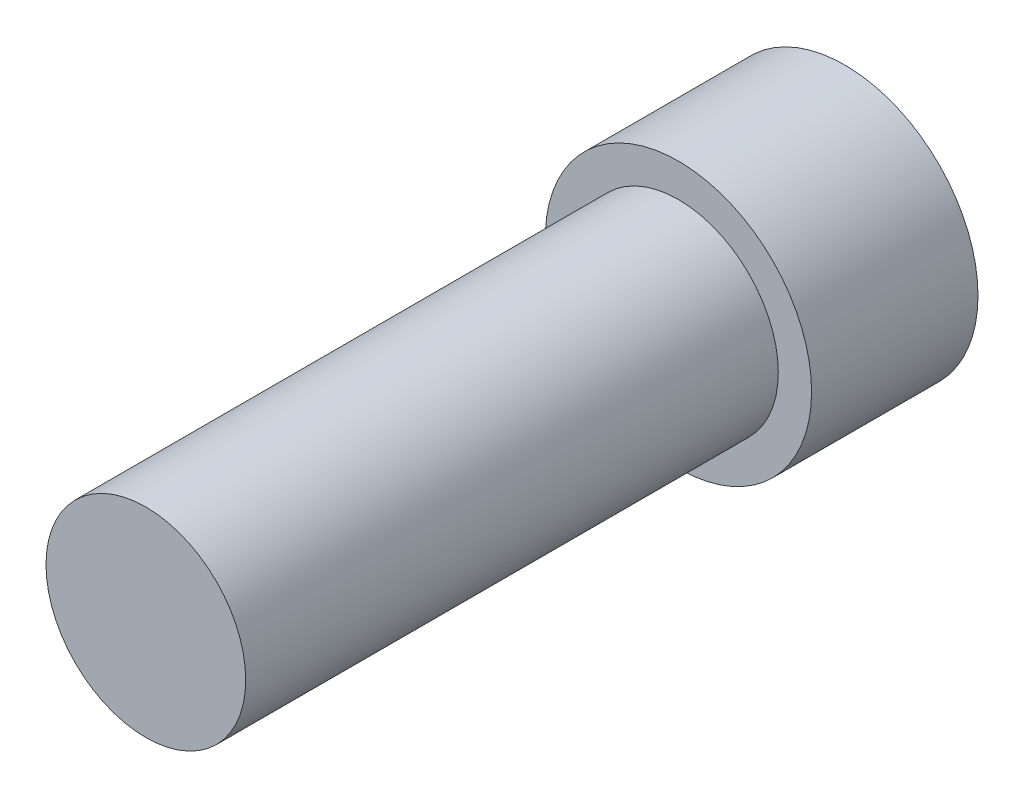
ISO-10303-21;
HEADER;
FILE_DESCRIPTION(('STEP AP214'),'2;1');
FILE_NAME('part.step','',(''),(''),'','','');
FILE_SCHEMA(('AUTOMOTIVE_DESIGN { 1 0 10303 214 1 1 1 1 }'));
ENDSEC;
DATA;
#1=APPLICATION_CONTEXT('core data for automotive mechanical design processes');
#2=APPLICATION_PROTOCOL_DEFINITION('international standard','automotive_design',2000,#1);
#3=PRODUCT_CONTEXT('',#1,'mechanical');
#4=PRODUCT('Part','Part','',(#3));
#5=PRODUCT_RELATED_PRODUCT_CATEGORY('part','',(#4));
#6=PRODUCT_DEFINITION_FORMATION('','',#4);
#7=PRODUCT_DEFINITION_CONTEXT('part definition',#1,'design');
#8=PRODUCT_DEFINITION('design','',#6,#7);
#9=PRODUCT_DEFINITION_SHAPE('','',#8);
#10=(LENGTH_UNIT() NAMED_UNIT(*) SI_UNIT(.MILLI.,.METRE.));
#11=(NAMED_UNIT(*) PLANE_ANGLE_UNIT() SI_UNIT($,.RADIAN.));
#12=(NAMED_UNIT(*) SI_UNIT($,.STERADIAN.) SOLID_ANGLE_UNIT());
#13=UNCERTAINTY_MEASURE_WITH_UNIT(LENGTH_MEASURE(1.E-05),#10,'distance_accuracy_value','');
#14=(GEOMETRIC_REPRESENTATION_CONTEXT(3) GLOBAL_UNCERTAINTY_ASSIGNED_CONTEXT((#13)) GLOBAL_UNIT_ASSIGNED_CONTEXT((#10,
#11,#12)) REPRESENTATION_CONTEXT('',''));
#15=CARTESIAN_POINT('',(0.,0.,0.));
#16=DIRECTION('',(0.,0.,1.));
#17=DIRECTION('',(1.,0.,0.));
#18=AXIS2_PLACEMENT_3D('',#15,#16,#17);
#19=CARTESIAN_POINT('',(0.,0.,2.5));
#20=DIRECTION('',(0.,0.,1.));
#21=DIRECTION('',(1.,0.,0.));
#22=AXIS2_PLACEMENT_3D('',#19,#20,#21);
#23=PLANE('',#22);
#24=CARTESIAN_POINT('',(0.,0.,2.5));
#25=DIRECTION('',(0.,0.,1.));
#26=DIRECTION('',(1.,0.,0.));
#27=AXIS2_PLACEMENT_3D('',#24,#25,#26);
#28=CIRCLE('',#27,1.5);
#29=CARTESIAN_POINT('',(1.5,0.,2.5));
#30=VERTEX_POINT('',#29);
#31=EDGE_CURVE('E173',#30,#30,#28,.T.);
#32=ORIENTED_EDGE('',*,*,#31,.F.);
#33=EDGE_LOOP('',(#32));
#34=FACE_BOUND('',#33,.T.);
#35=CARTESIAN_POINT('',(0.,0.,2.5));
#36=DIRECTION('',(0.,0.,1.));
#37=DIRECTION('',(1.,0.,0.));
#38=AXIS2_PLACEMENT_3D('',#35,#36,#37);
#39=CIRCLE('',#38,2.);
#40=CARTESIAN_POINT('',(2.,0.,2.5));
#41=VERTEX_POINT('',#40);
#42=EDGE_CURVE('E11',#41,#41,#39,.T.);
#43=ORIENTED_EDGE('',*,*,#42,.T.);
#44=EDGE_LOOP('',(#43));
#45=FACE_BOUND('',#44,.T.);
#46=ADVANCED_FACE('F37',(#34,#45),#23,.T.);
#47=CARTESIAN_POINT('',(0.,0.,0.));
#48=DIRECTION('',(0.,0.,1.));
#49=DIRECTION('',(1.,0.,0.));
#50=AXIS2_PLACEMENT_3D('',#47,#48,#49);
#51=PLANE('',#50);
#52=CARTESIAN_POINT('',(0.,0.,0.));
#53=DIRECTION('',(0.,0.,1.));
#54=DIRECTION('',(1.,0.,0.));
#55=AXIS2_PLACEMENT_3D('',#52,#53,#54);
#56=CIRCLE('',#55,2.);
#57=CARTESIAN_POINT('',(2.,0.,0.));
#58=VERTEX_POINT('',#57);
#59=EDGE_CURVE('E41',#58,#58,#56,.T.);
#60=ORIENTED_EDGE('',*,*,#59,.F.);
#61=EDGE_LOOP('',(#60));
#62=FACE_BOUND('',#61,.T.);
#63=DIRECTION('',(-0.979936991565401,-0.199307532626719,0.));
#64=VECTOR('',#63,1.);
#65=CARTESIAN_POINT('',(0.458074191553048,1.3687590614737,0.));
#66=LINE('',#65,#64);
#67=CARTESIAN_POINT('',(0.458074191553048,1.3687590614737,0.));
#68=VERTEX_POINT('',#67);
#69=CARTESIAN_POINT('',(-0.956343023119844,1.08108341743981,0.));
#70=VERTEX_POINT('',#69);
#71=EDGE_CURVE('E52',#68,#70,#66,.T.);
#72=ORIENTED_EDGE('',*,*,#71,.T.);
#73=DIRECTION('',(-0.317363109362366,-0.948304095117094,0.));
#74=VECTOR('',#73,1.);
#75=CARTESIAN_POINT('',(-0.956343023119844,1.08108341743981,0.));
#76=LINE('',#75,#74);
#77=CARTESIAN_POINT('',(-1.41441721467289,-0.28767564403389,0.));
#78=VERTEX_POINT('',#77);
#79=EDGE_CURVE('E112',#70,#78,#76,.T.);
#80=ORIENTED_EDGE('',*,*,#79,.T.);
#81=DIRECTION('',(0.662573882203035,-0.748996562490375,0.));
#82=VECTOR('',#81,1.);
#83=CARTESIAN_POINT('',(-1.41441721467289,-0.28767564403389,0.));
#84=LINE('',#83,#82);
#85=CARTESIAN_POINT('',(-0.458074191553046,-1.3687590614737,0.));
#86=VERTEX_POINT('',#85);
#87=EDGE_CURVE('E110',#78,#86,#84,.T.);
#88=ORIENTED_EDGE('',*,*,#87,.T.);
#89=DIRECTION('',(0.979936991565401,0.199307532626719,0.));
#90=VECTOR('',#89,1.);
#91=CARTESIAN_POINT('',(-0.458074191553046,-1.3687590614737,0.));
#92=LINE('',#91,#90);
#93=CARTESIAN_POINT('',(0.956343023119844,-1.08108341743981,0.));
#94=VERTEX_POINT('',#93);
#95=EDGE_CURVE('E88',#86,#94,#92,.T.);
#96=ORIENTED_EDGE('',*,*,#95,.T.);
#97=DIRECTION('',(0.317363109362366,0.948304095117094,0.));
#98=VECTOR('',#97,1.);
#99=CARTESIAN_POINT('',(0.956343023119844,-1.08108341743981,0.));
#100=LINE('',#99,#98);
#101=CARTESIAN_POINT('',(1.41441721467289,0.28767564403389,0.));
#102=VERTEX_POINT('',#101);
#103=EDGE_CURVE('E99',#94,#102,#100,.T.);
#104=ORIENTED_EDGE('',*,*,#103,.T.);
#105=DIRECTION('',(-0.662573882203035,0.748996562490376,0.));
#106=VECTOR('',#105,1.);
#107=CARTESIAN_POINT('',(1.41441721467289,0.28767564403389,0.));
#108=LINE('',#107,#106);
#109=EDGE_CURVE('E105',#102,#68,#108,.T.);
#110=ORIENTED_EDGE('',*,*,#109,.T.);
#111=EDGE_LOOP('',(#72,#80,#88,#96,#104,#110));
#112=FACE_BOUND('',#111,.T.);
#113=ADVANCED_FACE('F107',(#62,#112),#51,.F.);
#114=CARTESIAN_POINT('',(0.,0.,2.5));
#115=DIRECTION('',(0.,0.,-1.));
#116=DIRECTION('',(-1.,0.,0.));
#117=AXIS2_PLACEMENT_3D('',#114,#115,#116);
#118=CYLINDRICAL_SURFACE('',#117,2.);
#119=ORIENTED_EDGE('',*,*,#42,.F.);
#120=EDGE_LOOP('',(#119));
#121=FACE_BOUND('',#120,.T.);
#122=ORIENTED_EDGE('',*,*,#59,.T.);
#123=EDGE_LOOP('',(#122));
#124=FACE_BOUND('',#123,.T.);
#125=ADVANCED_FACE('F39',(#121,#124),#118,.T.);
#126=CARTESIAN_POINT('',(0.458074191553048,1.3687590614737,2.5));
#127=DIRECTION('',(0.199307532626719,-0.979936991565401,0.));
#128=DIRECTION('',(0.979936991565401,0.199307532626719,0.));
#129=AXIS2_PLACEMENT_3D('',#126,#127,#128);
#130=PLANE('',#129);
#131=ORIENTED_EDGE('',*,*,#71,.F.);
#132=DIRECTION('',(0.,0.,-1.));
#133=VECTOR('',#132,1.);
#134=CARTESIAN_POINT('',(0.458074191553048,1.3687590614737,2.5));
#135=LINE('',#134,#133);
#136=CARTESIAN_POINT('',(0.458074191553048,1.3687590614737,2.5));
#137=VERTEX_POINT('',#136);
#138=EDGE_CURVE('E117',#137,#68,#135,.T.);
#139=ORIENTED_EDGE('',*,*,#138,.F.);
#140=DIRECTION('',(-0.979936991565401,-0.199307532626719,0.));
#141=VECTOR('',#140,1.);
#142=CARTESIAN_POINT('',(0.458074191553048,1.3687590614737,2.5));
#143=LINE('',#142,#141);
#144=CARTESIAN_POINT('',(-0.956343023119844,1.08108341743981,2.5));
#145=VERTEX_POINT('',#144);
#146=EDGE_CURVE('E61',#137,#145,#143,.T.);
#147=ORIENTED_EDGE('',*,*,#146,.T.);
#148=DIRECTION('',(0.,0.,-1.));
#149=VECTOR('',#148,1.);
#150=CARTESIAN_POINT('',(-0.956343023119844,1.08108341743981,2.5));
#151=LINE('',#150,#149);
#152=EDGE_CURVE('E124',#145,#70,#151,.T.);
#153=ORIENTED_EDGE('',*,*,#152,.T.);
#154=EDGE_LOOP('',(#131,#139,#147,#153));
#155=FACE_BOUND('',#154,.T.);
#156=ADVANCED_FACE('F135',(#155),#130,.T.);
#157=CARTESIAN_POINT('',(-0.956343023119844,1.08108341743981,2.5));
#158=DIRECTION('',(0.948304095117094,-0.317363109362366,0.));
#159=DIRECTION('',(0.317363109362366,0.948304095117094,0.));
#160=AXIS2_PLACEMENT_3D('',#157,#158,#159);
#161=PLANE('',#160);
#162=ORIENTED_EDGE('',*,*,#79,.F.);
#163=ORIENTED_EDGE('',*,*,#152,.F.);
#164=DIRECTION('',(-0.317363109362366,-0.948304095117094,0.));
#165=VECTOR('',#164,1.);
#166=CARTESIAN_POINT('',(-0.956343023119844,1.08108341743981,2.5));
#167=LINE('',#166,#165);
#168=CARTESIAN_POINT('',(-1.41441721467289,-0.28767564403389,2.5));
#169=VERTEX_POINT('',#168);
#170=EDGE_CURVE('E180',#145,#169,#167,.T.);
#171=ORIENTED_EDGE('',*,*,#170,.T.);
#172=DIRECTION('',(0.,0.,-1.));
#173=VECTOR('',#172,1.);
#174=CARTESIAN_POINT('',(-1.41441721467289,-0.28767564403389,2.5));
#175=LINE('',#174,#173);
#176=EDGE_CURVE('E122',#169,#78,#175,.T.);
#177=ORIENTED_EDGE('',*,*,#176,.T.);
#178=EDGE_LOOP('',(#162,#163,#171,#177));
#179=FACE_BOUND('',#178,.T.);
#180=ADVANCED_FACE('F142',(#179),#161,.T.);
#181=CARTESIAN_POINT('',(-1.41441721467289,-0.28767564403389,2.5));
#182=DIRECTION('',(0.748996562490375,0.662573882203035,0.));
#183=DIRECTION('',(-0.662573882203035,0.748996562490375,0.));
#184=AXIS2_PLACEMENT_3D('',#181,#182,#183);
#185=PLANE('',#184);
#186=ORIENTED_EDGE('',*,*,#87,.F.);
#187=ORIENTED_EDGE('',*,*,#176,.F.);
#188=DIRECTION('',(0.662573882203035,-0.748996562490375,0.));
#189=VECTOR('',#188,1.);
#190=CARTESIAN_POINT('',(-1.41441721467289,-0.28767564403389,2.5));
#191=LINE('',#190,#189);
#192=CARTESIAN_POINT('',(-0.458074191553046,-1.3687590614737,2.5));
#193=VERTEX_POINT('',#192);
#194=EDGE_CURVE('E183',#169,#193,#191,.T.);
#195=ORIENTED_EDGE('',*,*,#194,.T.);
#196=DIRECTION('',(0.,0.,-1.));
#197=VECTOR('',#196,1.);
#198=CARTESIAN_POINT('',(-0.458074191553046,-1.3687590614737,2.5));
#199=LINE('',#198,#197);
#200=EDGE_CURVE('E95',#193,#86,#199,.T.);
#201=ORIENTED_EDGE('',*,*,#200,.T.);
#202=EDGE_LOOP('',(#186,#187,#195,#201));
#203=FACE_BOUND('',#202,.T.);
#204=ADVANCED_FACE('F145',(#203),#185,.T.);
#205=CARTESIAN_POINT('',(-0.458074191553046,-1.3687590614737,2.5));
#206=DIRECTION('',(-0.199307532626719,0.979936991565401,0.));
#207=DIRECTION('',(-0.979936991565401,-0.199307532626719,0.));
#208=AXIS2_PLACEMENT_3D('',#205,#206,#207);
#209=PLANE('',#208);
#210=ORIENTED_EDGE('',*,*,#95,.F.);
#211=ORIENTED_EDGE('',*,*,#200,.F.);
#212=DIRECTION('',(0.979936991565401,0.199307532626719,0.));
#213=VECTOR('',#212,1.);
#214=CARTESIAN_POINT('',(-0.458074191553046,-1.3687590614737,2.5));
#215=LINE('',#214,#213);
#216=CARTESIAN_POINT('',(0.956343023119844,-1.08108341743981,2.5));
#217=VERTEX_POINT('',#216);
#218=EDGE_CURVE('E92',#193,#217,#215,.T.);
#219=ORIENTED_EDGE('',*,*,#218,.T.);
#220=DIRECTION('',(0.,0.,-1.));
#221=VECTOR('',#220,1.);
#222=CARTESIAN_POINT('',(0.956343023119844,-1.08108341743981,2.5));
#223=LINE('',#222,#221);
#224=EDGE_CURVE('E83',#217,#94,#223,.T.);
#225=ORIENTED_EDGE('',*,*,#224,.T.);
#226=EDGE_LOOP('',(#210,#211,#219,#225));
#227=FACE_BOUND('',#226,.T.);
#228=ADVANCED_FACE('F85',(#227),#209,.T.);
#229=CARTESIAN_POINT('',(0.956343023119844,-1.08108341743981,2.5));
#230=DIRECTION('',(-0.948304095117094,0.317363109362366,0.));
#231=DIRECTION('',(-0.317363109362366,-0.948304095117094,0.));
#232=AXIS2_PLACEMENT_3D('',#229,#230,#231);
#233=PLANE('',#232);
#234=ORIENTED_EDGE('',*,*,#103,.F.);
#235=ORIENTED_EDGE('',*,*,#224,.F.);
#236=DIRECTION('',(0.317363109362366,0.948304095117094,0.));
#237=VECTOR('',#236,1.);
#238=CARTESIAN_POINT('',(0.956343023119844,-1.08108341743981,2.5));
#239=LINE('',#238,#237);
#240=CARTESIAN_POINT('',(1.41441721467289,0.28767564403389,2.5));
#241=VERTEX_POINT('',#240);
#242=EDGE_CURVE('E187',#217,#241,#239,.T.);
#243=ORIENTED_EDGE('',*,*,#242,.T.);
#244=DIRECTION('',(0.,0.,-1.));
#245=VECTOR('',#244,1.);
#246=CARTESIAN_POINT('',(1.41441721467289,0.28767564403389,2.5));
#247=LINE('',#246,#245);
#248=EDGE_CURVE('E96',#241,#102,#247,.T.);
#249=ORIENTED_EDGE('',*,*,#248,.T.);
#250=EDGE_LOOP('',(#234,#235,#243,#249));
#251=FACE_BOUND('',#250,.T.);
#252=ADVANCED_FACE('F100',(#251),#233,.T.);
#253=CARTESIAN_POINT('',(1.41441721467289,0.28767564403389,2.5));
#254=DIRECTION('',(-0.748996562490376,-0.662573882203035,0.));
#255=DIRECTION('',(0.662573882203035,-0.748996562490376,0.));
#256=AXIS2_PLACEMENT_3D('',#253,#254,#255);
#257=PLANE('',#256);
#258=ORIENTED_EDGE('',*,*,#109,.F.);
#259=ORIENTED_EDGE('',*,*,#248,.F.);
#260=DIRECTION('',(-0.662573882203035,0.748996562490376,0.));
#261=VECTOR('',#260,1.);
#262=CARTESIAN_POINT('',(1.41441721467289,0.28767564403389,2.5));
#263=LINE('',#262,#261);
#264=EDGE_CURVE('E119',#241,#137,#263,.T.);
#265=ORIENTED_EDGE('',*,*,#264,.T.);
#266=ORIENTED_EDGE('',*,*,#138,.T.);
#267=EDGE_LOOP('',(#258,#259,#265,#266));
#268=FACE_BOUND('',#267,.T.);
#269=ADVANCED_FACE('F154',(#268),#257,.T.);
#270=CARTESIAN_POINT('',(0.,0.,2.5));
#271=DIRECTION('',(0.,0.,1.));
#272=DIRECTION('',(1.,0.,0.));
#273=AXIS2_PLACEMENT_3D('',#270,#271,#272);
#274=PLANE('',#273);
#275=ORIENTED_EDGE('',*,*,#146,.F.);
#276=ORIENTED_EDGE('',*,*,#264,.F.);
#277=ORIENTED_EDGE('',*,*,#242,.F.);
#278=ORIENTED_EDGE('',*,*,#218,.F.);
#279=ORIENTED_EDGE('',*,*,#194,.F.);
#280=ORIENTED_EDGE('',*,*,#170,.F.);
#281=EDGE_LOOP('',(#275,#276,#277,#278,#279,#280));
#282=FACE_BOUND('',#281,.T.);
#283=ADVANCED_FACE('F157',(#282),#274,.F.);
#284=CARTESIAN_POINT('',(0.,0.,10.5));
#285=DIRECTION('',(0.,0.,-1.));
#286=DIRECTION('',(-1.,0.,0.));
#287=AXIS2_PLACEMENT_3D('',#284,#285,#286);
#288=CYLINDRICAL_SURFACE('',#287,1.5);
#289=CARTESIAN_POINT('',(0.,0.,10.5));
#290=DIRECTION('',(0.,0.,1.));
#291=DIRECTION('',(1.,0.,0.));
#292=AXIS2_PLACEMENT_3D('',#289,#290,#291);
#293=CIRCLE('',#292,1.5);
#294=CARTESIAN_POINT('',(1.5,0.,10.5));
#295=VERTEX_POINT('',#294);
#296=EDGE_CURVE('E172',#295,#295,#293,.T.);
#297=ORIENTED_EDGE('',*,*,#296,.F.);
#298=EDGE_LOOP('',(#297));
#299=FACE_BOUND('',#298,.T.);
#300=ORIENTED_EDGE('',*,*,#31,.T.);
#301=EDGE_LOOP('',(#300));
#302=FACE_BOUND('',#301,.T.);
#303=ADVANCED_FACE('F159',(#299,#302),#288,.T.);
#304=CARTESIAN_POINT('',(0.,0.,10.5));
#305=DIRECTION('',(0.,0.,1.));
#306=DIRECTION('',(1.,0.,0.));
#307=AXIS2_PLACEMENT_3D('',#304,#305,#306);
#308=PLANE('',#307);
#309=ORIENTED_EDGE('',*,*,#296,.T.);
#310=EDGE_LOOP('',(#309));
#311=FACE_BOUND('',#310,.T.);
#312=ADVANCED_FACE('F162',(#311),#308,.T.);
#313=CLOSED_SHELL('',(#46,#113,#125,#156,#180,#204,#228,#252,#269,#283,#303,#312));
#314=MANIFOLD_SOLID_BREP('B2',#313);
#315=ADVANCED_BREP_SHAPE_REPRESENTATION('',(#18,#314),#14);
#316=SHAPE_DEFINITION_REPRESENTATION(#9,#315);
ENDSEC;
END-ISO-10303-21;
